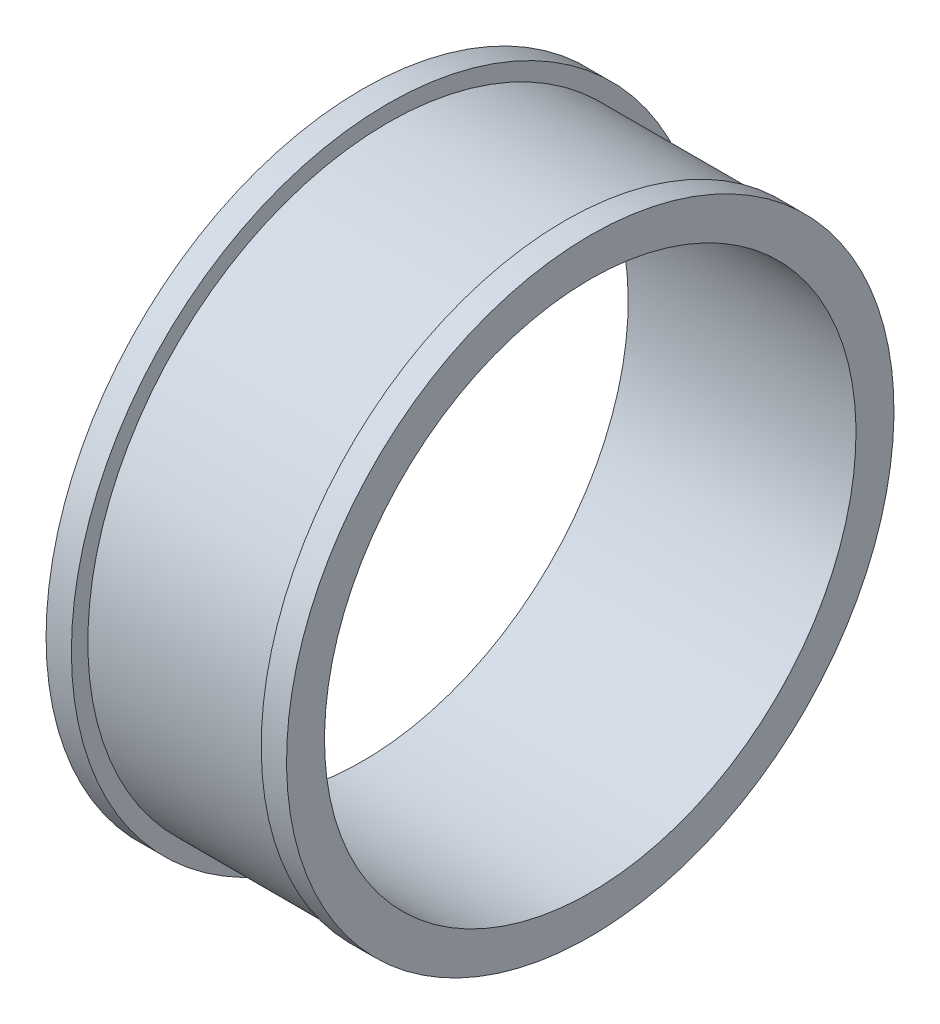
ISO-10303-21;
HEADER;
FILE_DESCRIPTION(('STEP AP214'),'2;1');
FILE_NAME('part.step','',(''),(''),'','','');
FILE_SCHEMA(('AUTOMOTIVE_DESIGN { 1 0 10303 214 1 1 1 1 }'));
ENDSEC;
DATA;
#1=APPLICATION_CONTEXT('core data for automotive mechanical design processes');
#2=APPLICATION_PROTOCOL_DEFINITION('international standard','automotive_design',2000,#1);
#3=PRODUCT_CONTEXT('',#1,'mechanical');
#4=PRODUCT('Part','Part','',(#3));
#5=PRODUCT_RELATED_PRODUCT_CATEGORY('part','',(#4));
#6=PRODUCT_DEFINITION_FORMATION('','',#4);
#7=PRODUCT_DEFINITION_CONTEXT('part definition',#1,'design');
#8=PRODUCT_DEFINITION('design','',#6,#7);
#9=PRODUCT_DEFINITION_SHAPE('','',#8);
#10=(LENGTH_UNIT() NAMED_UNIT(*) SI_UNIT(.MILLI.,.METRE.));
#11=(NAMED_UNIT(*) PLANE_ANGLE_UNIT() SI_UNIT($,.RADIAN.));
#12=(NAMED_UNIT(*) SI_UNIT($,.STERADIAN.) SOLID_ANGLE_UNIT());
#13=UNCERTAINTY_MEASURE_WITH_UNIT(LENGTH_MEASURE(1.E-05),#10,'distance_accuracy_value','');
#14=(GEOMETRIC_REPRESENTATION_CONTEXT(3) GLOBAL_UNCERTAINTY_ASSIGNED_CONTEXT((#13)) GLOBAL_UNIT_ASSIGNED_CONTEXT((#10,
#11,#12)) REPRESENTATION_CONTEXT('',''));
#15=CARTESIAN_POINT('',(0.,0.,0.));
#16=DIRECTION('',(0.,0.,1.));
#17=DIRECTION('',(1.,0.,0.));
#18=AXIS2_PLACEMENT_3D('',#15,#16,#17);
#19=CARTESIAN_POINT('',(-275.5,667.332012286222,-386.357743681072));
#20=DIRECTION('',(1.,0.,0.));
#21=DIRECTION('',(0.,1.,0.));
#22=AXIS2_PLACEMENT_3D('',#19,#20,#21);
#23=CYLINDRICAL_SURFACE('',#22,11.85);
#24=CARTESIAN_POINT('',(-272.,667.332012286222,-386.357743681072));
#25=DIRECTION('',(1.,0.,0.));
#26=DIRECTION('',(0.,1.,0.));
#27=AXIS2_PLACEMENT_3D('',#24,#25,#26);
#28=CIRCLE('',#27,11.85);
#29=CARTESIAN_POINT('',(-272.,679.182012286222,-386.357743681072));
#30=VERTEX_POINT('',#29);
#31=EDGE_CURVE('E18',#30,#30,#28,.F.);
#32=ORIENTED_EDGE('',*,*,#31,.T.);
#33=EDGE_LOOP('',(#32));
#34=FACE_BOUND('',#33,.T.);
#35=CARTESIAN_POINT('',(-279.,667.332012286222,-386.357743681072));
#36=DIRECTION('',(1.,0.,0.));
#37=DIRECTION('',(0.,1.,0.));
#38=AXIS2_PLACEMENT_3D('',#35,#36,#37);
#39=CIRCLE('',#38,11.85);
#40=CARTESIAN_POINT('',(-279.,679.182012286222,-386.357743681072));
#41=VERTEX_POINT('',#40);
#42=EDGE_CURVE('E40',#41,#41,#39,.F.);
#43=ORIENTED_EDGE('',*,*,#42,.F.);
#44=EDGE_LOOP('',(#43));
#45=FACE_BOUND('',#44,.T.);
#46=ADVANCED_FACE('F15',(#34,#45),#23,.T.);
#47=CARTESIAN_POINT('',(-272.,667.332012286222,-386.357743681072));
#48=DIRECTION('',(1.,0.,0.));
#49=DIRECTION('',(0.,0.,-1.));
#50=AXIS2_PLACEMENT_3D('',#47,#48,#49);
#51=PLANE('',#50);
#52=ORIENTED_EDGE('',*,*,#31,.F.);
#53=EDGE_LOOP('',(#52));
#54=FACE_BOUND('',#53,.T.);
#55=CARTESIAN_POINT('',(-272.,667.332012286222,-386.357743681072));
#56=DIRECTION('',(1.,0.,0.));
#57=DIRECTION('',(0.,1.,0.));
#58=AXIS2_PLACEMENT_3D('',#55,#56,#57);
#59=CIRCLE('',#58,12.);
#60=CARTESIAN_POINT('',(-272.,679.332012286222,-386.357743681072));
#61=VERTEX_POINT('',#60);
#62=EDGE_CURVE('E38',#61,#61,#59,.T.);
#63=ORIENTED_EDGE('',*,*,#62,.F.);
#64=EDGE_LOOP('',(#63));
#65=FACE_BOUND('',#64,.T.);
#66=ADVANCED_FACE('F49',(#54,#65),#51,.F.);
#67=CARTESIAN_POINT('',(-279.,667.332012286222,-386.357743681072));
#68=DIRECTION('',(1.,0.,0.));
#69=DIRECTION('',(0.,0.,-1.));
#70=AXIS2_PLACEMENT_3D('',#67,#68,#69);
#71=PLANE('',#70);
#72=ORIENTED_EDGE('',*,*,#42,.T.);
#73=EDGE_LOOP('',(#72));
#74=FACE_BOUND('',#73,.T.);
#75=CARTESIAN_POINT('',(-279.,667.332012286222,-386.357743681072));
#76=DIRECTION('',(1.,0.,0.));
#77=DIRECTION('',(0.,1.,0.));
#78=AXIS2_PLACEMENT_3D('',#75,#76,#77);
#79=CIRCLE('',#78,12.5);
#80=CARTESIAN_POINT('',(-279.,679.832012286222,-386.357743681072));
#81=VERTEX_POINT('',#80);
#82=EDGE_CURVE('E35',#81,#81,#79,.F.);
#83=ORIENTED_EDGE('',*,*,#82,.F.);
#84=EDGE_LOOP('',(#83));
#85=FACE_BOUND('',#84,.T.);
#86=ADVANCED_FACE('F52',(#74,#85),#71,.T.);
#87=CARTESIAN_POINT('',(-275.,667.332012286222,-386.357743681072));
#88=DIRECTION('',(1.,0.,0.));
#89=DIRECTION('',(0.,1.,0.));
#90=AXIS2_PLACEMENT_3D('',#87,#88,#89);
#91=CYLINDRICAL_SURFACE('',#90,12.);
#92=CARTESIAN_POINT('',(-271.,667.332012286222,-386.357743681072));
#93=DIRECTION('',(1.,0.,0.));
#94=DIRECTION('',(0.,1.,0.));
#95=AXIS2_PLACEMENT_3D('',#92,#93,#94);
#96=CIRCLE('',#95,12.);
#97=CARTESIAN_POINT('',(-271.,679.332012286222,-386.357743681072));
#98=VERTEX_POINT('',#97);
#99=EDGE_CURVE('E32',#98,#98,#96,.T.);
#100=ORIENTED_EDGE('',*,*,#99,.F.);
#101=EDGE_LOOP('',(#100));
#102=FACE_BOUND('',#101,.T.);
#103=ORIENTED_EDGE('',*,*,#62,.T.);
#104=EDGE_LOOP('',(#103));
#105=FACE_BOUND('',#104,.T.);
#106=ADVANCED_FACE('F55',(#102,#105),#91,.T.);
#107=CARTESIAN_POINT('',(-279.5,667.332012286222,-386.357743681072));
#108=DIRECTION('',(1.,0.,0.));
#109=DIRECTION('',(0.,1.,0.));
#110=AXIS2_PLACEMENT_3D('',#107,#108,#109);
#111=CYLINDRICAL_SURFACE('',#110,12.5);
#112=CARTESIAN_POINT('',(-280.,667.332012286222,-386.357743681072));
#113=DIRECTION('',(1.,0.,0.));
#114=DIRECTION('',(0.,1.,0.));
#115=AXIS2_PLACEMENT_3D('',#112,#113,#114);
#116=CIRCLE('',#115,12.5);
#117=CARTESIAN_POINT('',(-280.,679.832012286222,-386.357743681072));
#118=VERTEX_POINT('',#117);
#119=EDGE_CURVE('E27',#118,#118,#116,.F.);
#120=ORIENTED_EDGE('',*,*,#119,.F.);
#121=EDGE_LOOP('',(#120));
#122=FACE_BOUND('',#121,.T.);
#123=ORIENTED_EDGE('',*,*,#82,.T.);
#124=EDGE_LOOP('',(#123));
#125=FACE_BOUND('',#124,.T.);
#126=ADVANCED_FACE('F57',(#122,#125),#111,.T.);
#127=CARTESIAN_POINT('',(-271.,667.332012286222,-386.357743681072));
#128=DIRECTION('',(1.,0.,0.));
#129=DIRECTION('',(0.,0.,-1.));
#130=AXIS2_PLACEMENT_3D('',#127,#128,#129);
#131=PLANE('',#130);
#132=CARTESIAN_POINT('',(-271.,667.332012286222,-386.357743681072));
#133=DIRECTION('',(1.,0.,0.));
#134=DIRECTION('',(0.,1.,0.));
#135=AXIS2_PLACEMENT_3D('',#132,#133,#134);
#136=CIRCLE('',#135,10.5);
#137=CARTESIAN_POINT('',(-271.,677.832012286222,-386.357743681072));
#138=VERTEX_POINT('',#137);
#139=EDGE_CURVE('E22',#138,#138,#136,.F.);
#140=ORIENTED_EDGE('',*,*,#139,.T.);
#141=EDGE_LOOP('',(#140));
#142=FACE_BOUND('',#141,.T.);
#143=ORIENTED_EDGE('',*,*,#99,.T.);
#144=EDGE_LOOP('',(#143));
#145=FACE_BOUND('',#144,.T.);
#146=ADVANCED_FACE('F65',(#142,#145),#131,.T.);
#147=CARTESIAN_POINT('',(-280.,667.332012286222,-386.357743681072));
#148=DIRECTION('',(-1.,0.,0.));
#149=DIRECTION('',(0.,0.,1.));
#150=AXIS2_PLACEMENT_3D('',#147,#148,#149);
#151=PLANE('',#150);
#152=CARTESIAN_POINT('',(-280.,667.332012286222,-386.357743681072));
#153=DIRECTION('',(1.,0.,0.));
#154=DIRECTION('',(0.,1.,0.));
#155=AXIS2_PLACEMENT_3D('',#152,#153,#154);
#156=CIRCLE('',#155,10.5);
#157=CARTESIAN_POINT('',(-280.,677.832012286222,-386.357743681072));
#158=VERTEX_POINT('',#157);
#159=EDGE_CURVE('E10',#158,#158,#156,.T.);
#160=ORIENTED_EDGE('',*,*,#159,.T.);
#161=EDGE_LOOP('',(#160));
#162=FACE_BOUND('',#161,.T.);
#163=ORIENTED_EDGE('',*,*,#119,.T.);
#164=EDGE_LOOP('',(#163));
#165=FACE_BOUND('',#164,.T.);
#166=ADVANCED_FACE('F72',(#162,#165),#151,.T.);
#167=CARTESIAN_POINT('',(-275.5,667.332012286222,-386.357743681072));
#168=DIRECTION('',(1.,0.,0.));
#169=DIRECTION('',(0.,1.,0.));
#170=AXIS2_PLACEMENT_3D('',#167,#168,#169);
#171=CYLINDRICAL_SURFACE('',#170,10.5);
#172=ORIENTED_EDGE('',*,*,#159,.F.);
#173=EDGE_LOOP('',(#172));
#174=FACE_BOUND('',#173,.T.);
#175=ORIENTED_EDGE('',*,*,#139,.F.);
#176=EDGE_LOOP('',(#175));
#177=FACE_BOUND('',#176,.T.);
#178=ADVANCED_FACE('F70',(#174,#177),#171,.F.);
#179=CLOSED_SHELL('',(#46,#66,#86,#106,#126,#146,#166,#178));
#180=MANIFOLD_SOLID_BREP('B1',#179);
#181=ADVANCED_BREP_SHAPE_REPRESENTATION('',(#18,#180),#14);
#182=SHAPE_DEFINITION_REPRESENTATION(#9,#181);
ENDSEC;
END-ISO-10303-21;
